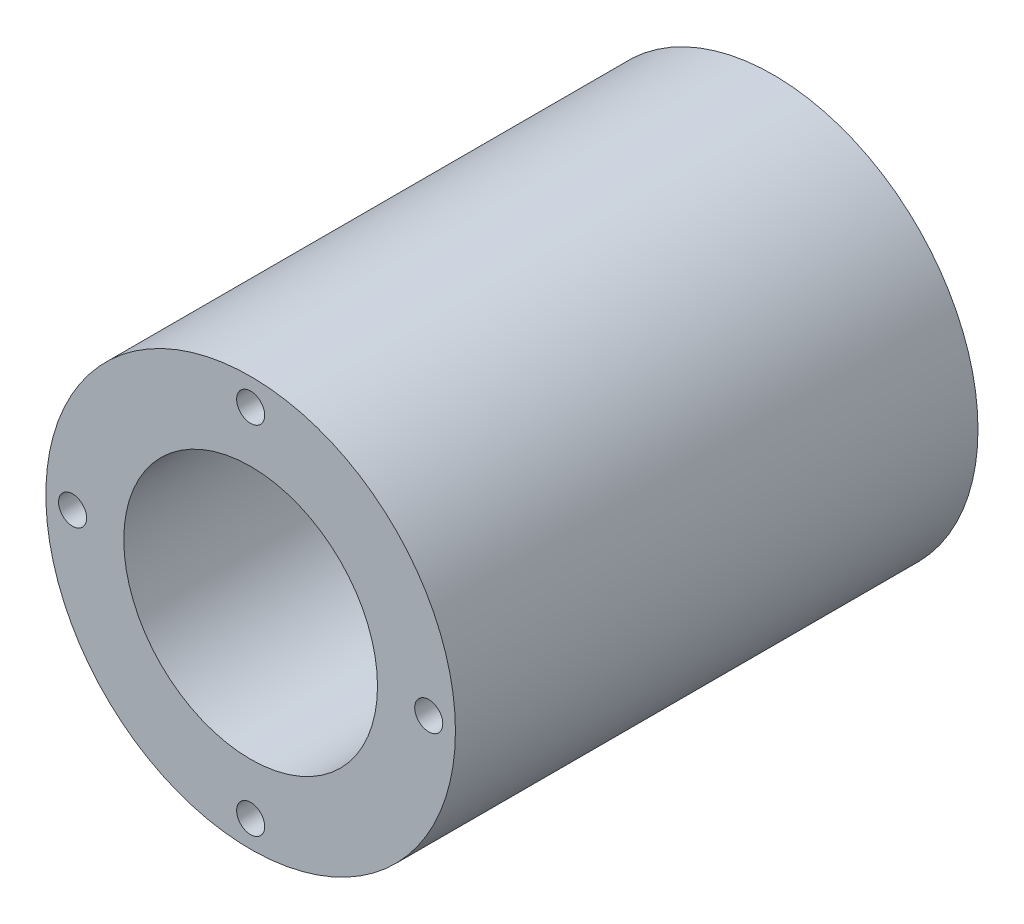
ISO-10303-21;
HEADER;
FILE_DESCRIPTION(('STEP AP214'),'2;1');
FILE_NAME('part.step','',(''),(''),'','','');
FILE_SCHEMA(('AUTOMOTIVE_DESIGN { 1 0 10303 214 1 1 1 1 }'));
ENDSEC;
DATA;
#1=APPLICATION_CONTEXT('core data for automotive mechanical design processes');
#2=APPLICATION_PROTOCOL_DEFINITION('international standard','automotive_design',2000,#1);
#3=PRODUCT_CONTEXT('',#1,'mechanical');
#4=PRODUCT('Part','Part','',(#3));
#5=PRODUCT_RELATED_PRODUCT_CATEGORY('part','',(#4));
#6=PRODUCT_DEFINITION_FORMATION('','',#4);
#7=PRODUCT_DEFINITION_CONTEXT('part definition',#1,'design');
#8=PRODUCT_DEFINITION('design','',#6,#7);
#9=PRODUCT_DEFINITION_SHAPE('','',#8);
#10=(LENGTH_UNIT() NAMED_UNIT(*) SI_UNIT(.MILLI.,.METRE.));
#11=(NAMED_UNIT(*) PLANE_ANGLE_UNIT() SI_UNIT($,.RADIAN.));
#12=(NAMED_UNIT(*) SI_UNIT($,.STERADIAN.) SOLID_ANGLE_UNIT());
#13=UNCERTAINTY_MEASURE_WITH_UNIT(LENGTH_MEASURE(1.E-05),#10,'distance_accuracy_value','');
#14=(GEOMETRIC_REPRESENTATION_CONTEXT(3) GLOBAL_UNCERTAINTY_ASSIGNED_CONTEXT((#13)) GLOBAL_UNIT_ASSIGNED_CONTEXT((#10,
#11,#12)) REPRESENTATION_CONTEXT('',''));
#15=CARTESIAN_POINT('',(0.,0.,0.));
#16=DIRECTION('',(0.,0.,1.));
#17=DIRECTION('',(1.,0.,0.));
#18=AXIS2_PLACEMENT_3D('',#15,#16,#17);
#19=CARTESIAN_POINT('',(0.,0.,119.469000076));
#20=DIRECTION('',(0.,0.,-1.));
#21=DIRECTION('',(-1.,0.,0.));
#22=AXIS2_PLACEMENT_3D('',#19,#20,#21);
#23=PLANE('',#22);
#24=CARTESIAN_POINT('',(-31.75,3.32563597524808E-13,119.469000076));
#25=DIRECTION('',(0.,0.,1.));
#26=DIRECTION('',(1.,0.,0.));
#27=AXIS2_PLACEMENT_3D('',#24,#25,#26);
#28=CIRCLE('',#27,2.5);
#29=CARTESIAN_POINT('',(-29.25,3.32563597524808E-13,119.469000076));
#30=VERTEX_POINT('',#29);
#31=EDGE_CURVE('E88',#30,#30,#28,.T.);
#32=ORIENTED_EDGE('',*,*,#31,.F.);
#33=EDGE_LOOP('',(#32));
#34=FACE_BOUND('',#33,.T.);
#35=CARTESIAN_POINT('',(0.,-31.75,119.469000076));
#36=DIRECTION('',(0.,0.,1.));
#37=DIRECTION('',(1.,0.,0.));
#38=AXIS2_PLACEMENT_3D('',#35,#36,#37);
#39=CIRCLE('',#38,2.5);
#40=CARTESIAN_POINT('',(2.5,-31.75,119.469000076));
#41=VERTEX_POINT('',#40);
#42=EDGE_CURVE('E87',#41,#41,#39,.T.);
#43=ORIENTED_EDGE('',*,*,#42,.F.);
#44=EDGE_LOOP('',(#43));
#45=FACE_BOUND('',#44,.T.);
#46=CARTESIAN_POINT('',(31.75,-1.10854532508269E-13,119.469000076));
#47=DIRECTION('',(0.,0.,1.));
#48=DIRECTION('',(1.,0.,0.));
#49=AXIS2_PLACEMENT_3D('',#46,#47,#48);
#50=CIRCLE('',#49,2.5);
#51=CARTESIAN_POINT('',(34.25,-1.10854532508269E-13,119.469000076));
#52=VERTEX_POINT('',#51);
#53=EDGE_CURVE('E98',#52,#52,#50,.T.);
#54=ORIENTED_EDGE('',*,*,#53,.F.);
#55=EDGE_LOOP('',(#54));
#56=FACE_BOUND('',#55,.T.);
#57=CARTESIAN_POINT('',(0.,31.75,119.469000076));
#58=DIRECTION('',(0.,0.,1.));
#59=DIRECTION('',(1.,0.,0.));
#60=AXIS2_PLACEMENT_3D('',#57,#58,#59);
#61=CIRCLE('',#60,2.5);
#62=CARTESIAN_POINT('',(2.5,31.75,119.469000076));
#63=VERTEX_POINT('',#62);
#64=EDGE_CURVE('E104',#63,#63,#61,.T.);
#65=ORIENTED_EDGE('',*,*,#64,.F.);
#66=EDGE_LOOP('',(#65));
#67=FACE_BOUND('',#66,.T.);
#68=CARTESIAN_POINT('',(0.,0.,119.469000076));
#69=DIRECTION('',(0.,0.,1.));
#70=DIRECTION('',(1.,0.,0.));
#71=AXIS2_PLACEMENT_3D('',#68,#69,#70);
#72=CIRCLE('',#71,22.6187);
#73=CARTESIAN_POINT('',(22.6187,0.,119.469000076));
#74=VERTEX_POINT('',#73);
#75=EDGE_CURVE('E11',#74,#74,#72,.T.);
#76=ORIENTED_EDGE('',*,*,#75,.F.);
#77=EDGE_LOOP('',(#76));
#78=FACE_BOUND('',#77,.T.);
#79=CARTESIAN_POINT('',(0.,0.,119.469000076));
#80=DIRECTION('',(0.,0.,1.));
#81=DIRECTION('',(1.,0.,0.));
#82=AXIS2_PLACEMENT_3D('',#79,#80,#81);
#83=CIRCLE('',#82,36.5125);
#84=CARTESIAN_POINT('',(36.5125,0.,119.469000076));
#85=VERTEX_POINT('',#84);
#86=EDGE_CURVE('E146',#85,#85,#83,.T.);
#87=ORIENTED_EDGE('',*,*,#86,.T.);
#88=EDGE_LOOP('',(#87));
#89=FACE_BOUND('',#88,.T.);
#90=ADVANCED_FACE('F39',(#34,#45,#56,#67,#78,#89),#23,.F.);
#91=CARTESIAN_POINT('',(0.,0.,119.469000076));
#92=DIRECTION('',(0.,0.,1.));
#93=DIRECTION('',(1.,0.,0.));
#94=AXIS2_PLACEMENT_3D('',#91,#92,#93);
#95=CYLINDRICAL_SURFACE('',#94,22.6187);
#96=CARTESIAN_POINT('',(0.,0.,26.3049999359999));
#97=DIRECTION('',(0.,0.,1.));
#98=DIRECTION('',(1.,0.,0.));
#99=AXIS2_PLACEMENT_3D('',#96,#97,#98);
#100=CIRCLE('',#99,22.6187);
#101=CARTESIAN_POINT('',(22.6187,0.,26.3049999359999));
#102=VERTEX_POINT('',#101);
#103=EDGE_CURVE('E46',#102,#102,#100,.T.);
#104=ORIENTED_EDGE('',*,*,#103,.F.);
#105=EDGE_LOOP('',(#104));
#106=FACE_BOUND('',#105,.T.);
#107=ORIENTED_EDGE('',*,*,#75,.T.);
#108=EDGE_LOOP('',(#107));
#109=FACE_BOUND('',#108,.T.);
#110=ADVANCED_FACE('F157',(#106,#109),#95,.F.);
#111=CARTESIAN_POINT('',(0.,0.,26.3049999359999));
#112=DIRECTION('',(0.,0.,-1.));
#113=DIRECTION('',(-1.,0.,0.));
#114=AXIS2_PLACEMENT_3D('',#111,#112,#113);
#115=PLANE('',#114);
#116=CARTESIAN_POINT('',(-26.4705861096263,15.2828000160003,26.3049999359999));
#117=DIRECTION('',(0.,0.,-1.));
#118=DIRECTION('',(-1.,0.,0.));
#119=AXIS2_PLACEMENT_3D('',#116,#117,#118);
#120=CIRCLE('',#119,2.49999999999999);
#121=CARTESIAN_POINT('',(-28.9705861096263,15.2828000160003,26.3049999359999));
#122=VERTEX_POINT('',#121);
#123=EDGE_CURVE('E110',#122,#122,#120,.T.);
#124=ORIENTED_EDGE('',*,*,#123,.F.);
#125=EDGE_LOOP('',(#124));
#126=FACE_BOUND('',#125,.T.);
#127=CARTESIAN_POINT('',(-26.4705861096266,-15.2828000159998,26.3049999359999));
#128=DIRECTION('',(0.,0.,-1.));
#129=DIRECTION('',(-1.,0.,0.));
#130=AXIS2_PLACEMENT_3D('',#127,#128,#129);
#131=CIRCLE('',#130,2.49999999999999);
#132=CARTESIAN_POINT('',(-28.9705861096266,-15.2828000159998,26.3049999359999));
#133=VERTEX_POINT('',#132);
#134=EDGE_CURVE('E116',#133,#133,#131,.T.);
#135=ORIENTED_EDGE('',*,*,#134,.F.);
#136=EDGE_LOOP('',(#135));
#137=FACE_BOUND('',#136,.T.);
#138=CARTESIAN_POINT('',(0.,-30.565600032,26.3049999359999));
#139=DIRECTION('',(0.,0.,-1.));
#140=DIRECTION('',(-1.,0.,0.));
#141=AXIS2_PLACEMENT_3D('',#138,#139,#140);
#142=CIRCLE('',#141,2.49999999999999);
#143=CARTESIAN_POINT('',(-2.49999999999999,-30.565600032,26.3049999359999));
#144=VERTEX_POINT('',#143);
#145=EDGE_CURVE('E122',#144,#144,#142,.T.);
#146=ORIENTED_EDGE('',*,*,#145,.F.);
#147=EDGE_LOOP('',(#146));
#148=FACE_BOUND('',#147,.T.);
#149=CARTESIAN_POINT('',(26.4705861096264,-15.2828000160001,26.3049999359999));
#150=DIRECTION('',(0.,0.,-1.));
#151=DIRECTION('',(-1.,0.,0.));
#152=AXIS2_PLACEMENT_3D('',#149,#150,#151);
#153=CIRCLE('',#152,2.49999999999999);
#154=CARTESIAN_POINT('',(23.9705861096264,-15.2828000160001,26.3049999359999));
#155=VERTEX_POINT('',#154);
#156=EDGE_CURVE('E128',#155,#155,#153,.T.);
#157=ORIENTED_EDGE('',*,*,#156,.F.);
#158=EDGE_LOOP('',(#157));
#159=FACE_BOUND('',#158,.T.);
#160=CARTESIAN_POINT('',(26.4705861096265,15.2828000159999,26.3049999359999));
#161=DIRECTION('',(0.,0.,-1.));
#162=DIRECTION('',(-1.,0.,0.));
#163=AXIS2_PLACEMENT_3D('',#160,#161,#162);
#164=CIRCLE('',#163,2.49999999999999);
#165=CARTESIAN_POINT('',(23.9705861096265,15.2828000159999,26.3049999359999));
#166=VERTEX_POINT('',#165);
#167=EDGE_CURVE('E134',#166,#166,#164,.T.);
#168=ORIENTED_EDGE('',*,*,#167,.F.);
#169=EDGE_LOOP('',(#168));
#170=FACE_BOUND('',#169,.T.);
#171=CARTESIAN_POINT('',(0.,30.565600032,26.3049999359999));
#172=DIRECTION('',(0.,0.,-1.));
#173=DIRECTION('',(-1.,0.,0.));
#174=AXIS2_PLACEMENT_3D('',#171,#172,#173);
#175=CIRCLE('',#174,2.49999999999999);
#176=CARTESIAN_POINT('',(-2.49999999999999,30.565600032,26.3049999359999));
#177=VERTEX_POINT('',#176);
#178=EDGE_CURVE('E140',#177,#177,#175,.T.);
#179=ORIENTED_EDGE('',*,*,#178,.F.);
#180=EDGE_LOOP('',(#179));
#181=FACE_BOUND('',#180,.T.);
#182=ORIENTED_EDGE('',*,*,#103,.T.);
#183=EDGE_LOOP('',(#182));
#184=FACE_BOUND('',#183,.T.);
#185=CARTESIAN_POINT('',(0.,0.,26.3049999359999));
#186=DIRECTION('',(0.,0.,1.));
#187=DIRECTION('',(1.,0.,0.));
#188=AXIS2_PLACEMENT_3D('',#185,#186,#187);
#189=CIRCLE('',#188,36.5125);
#190=CARTESIAN_POINT('',(36.5125,0.,26.3049999359999));
#191=VERTEX_POINT('',#190);
#192=EDGE_CURVE('E149',#191,#191,#189,.T.);
#193=ORIENTED_EDGE('',*,*,#192,.F.);
#194=EDGE_LOOP('',(#193));
#195=FACE_BOUND('',#194,.T.);
#196=ADVANCED_FACE('F154',(#126,#137,#148,#159,#170,#181,#184,#195),#115,.T.);
#197=CARTESIAN_POINT('',(0.,0.,119.469000076));
#198=DIRECTION('',(0.,0.,1.));
#199=DIRECTION('',(1.,0.,0.));
#200=AXIS2_PLACEMENT_3D('',#197,#198,#199);
#201=CYLINDRICAL_SURFACE('',#200,36.5125);
#202=ORIENTED_EDGE('',*,*,#192,.T.);
#203=EDGE_LOOP('',(#202));
#204=FACE_BOUND('',#203,.T.);
#205=ORIENTED_EDGE('',*,*,#86,.F.);
#206=EDGE_LOOP('',(#205));
#207=FACE_BOUND('',#206,.T.);
#208=ADVANCED_FACE('F167',(#204,#207),#201,.T.);
#209=CARTESIAN_POINT('',(0.,30.565600032,41.3049999359999));
#210=DIRECTION('',(0.,0.,-1.));
#211=DIRECTION('',(-1.,0.,0.));
#212=AXIS2_PLACEMENT_3D('',#209,#210,#211);
#213=CONICAL_SURFACE('',#212,2.49999999999999,1.02974425867665);
#214=CARTESIAN_POINT('',(0.,30.565600032,42.8071514835688));
#215=VERTEX_POINT('',#214);
#216=VERTEX_LOOP('',#215);
#217=FACE_BOUND('',#216,.T.);
#218=CARTESIAN_POINT('',(0.,30.565600032,41.3049999359999));
#219=DIRECTION('',(0.,0.,-1.));
#220=DIRECTION('',(-1.,0.,0.));
#221=AXIS2_PLACEMENT_3D('',#218,#219,#220);
#222=CIRCLE('',#221,2.49999999999999);
#223=CARTESIAN_POINT('',(-2.49999999999999,30.565600032,41.3049999359999));
#224=VERTEX_POINT('',#223);
#225=EDGE_CURVE('E143',#224,#224,#222,.T.);
#226=ORIENTED_EDGE('',*,*,#225,.T.);
#227=EDGE_LOOP('',(#226));
#228=FACE_BOUND('',#227,.T.);
#229=ADVANCED_FACE('F169',(#217,#228),#213,.F.);
#230=CARTESIAN_POINT('',(0.,30.565600032,26.3049999359999));
#231=DIRECTION('',(0.,0.,-1.));
#232=DIRECTION('',(-1.,0.,0.));
#233=AXIS2_PLACEMENT_3D('',#230,#231,#232);
#234=CYLINDRICAL_SURFACE('',#233,2.49999999999999);
#235=ORIENTED_EDGE('',*,*,#225,.F.);
#236=EDGE_LOOP('',(#235));
#237=FACE_BOUND('',#236,.T.);
#238=ORIENTED_EDGE('',*,*,#178,.T.);
#239=EDGE_LOOP('',(#238));
#240=FACE_BOUND('',#239,.T.);
#241=ADVANCED_FACE('F176',(#237,#240),#234,.F.);
#242=CARTESIAN_POINT('',(26.4705861096265,15.2828000159999,41.3049999359999));
#243=DIRECTION('',(0.,0.,-1.));
#244=DIRECTION('',(-1.,0.,0.));
#245=AXIS2_PLACEMENT_3D('',#242,#243,#244);
#246=CONICAL_SURFACE('',#245,2.49999999999999,1.02974425867665);
#247=CARTESIAN_POINT('',(26.4705861096265,15.2828000159999,42.8071514835688));
#248=VERTEX_POINT('',#247);
#249=VERTEX_LOOP('',#248);
#250=FACE_BOUND('',#249,.T.);
#251=CARTESIAN_POINT('',(26.4705861096265,15.2828000159999,41.3049999359999));
#252=DIRECTION('',(0.,0.,-1.));
#253=DIRECTION('',(-1.,0.,0.));
#254=AXIS2_PLACEMENT_3D('',#251,#252,#253);
#255=CIRCLE('',#254,2.49999999999999);
#256=CARTESIAN_POINT('',(23.9705861096265,15.2828000159999,41.3049999359999));
#257=VERTEX_POINT('',#256);
#258=EDGE_CURVE('E137',#257,#257,#255,.T.);
#259=ORIENTED_EDGE('',*,*,#258,.T.);
#260=EDGE_LOOP('',(#259));
#261=FACE_BOUND('',#260,.T.);
#262=ADVANCED_FACE('F183',(#250,#261),#246,.F.);
#263=CARTESIAN_POINT('',(26.4705861096265,15.2828000159999,26.3049999359999));
#264=DIRECTION('',(0.,0.,-1.));
#265=DIRECTION('',(-1.,0.,0.));
#266=AXIS2_PLACEMENT_3D('',#263,#264,#265);
#267=CYLINDRICAL_SURFACE('',#266,2.49999999999999);
#268=ORIENTED_EDGE('',*,*,#258,.F.);
#269=EDGE_LOOP('',(#268));
#270=FACE_BOUND('',#269,.T.);
#271=ORIENTED_EDGE('',*,*,#167,.T.);
#272=EDGE_LOOP('',(#271));
#273=FACE_BOUND('',#272,.T.);
#274=ADVANCED_FACE('F187',(#270,#273),#267,.F.);
#275=CARTESIAN_POINT('',(26.4705861096264,-15.2828000160001,41.3049999359999));
#276=DIRECTION('',(0.,0.,-1.));
#277=DIRECTION('',(-1.,0.,0.));
#278=AXIS2_PLACEMENT_3D('',#275,#276,#277);
#279=CONICAL_SURFACE('',#278,2.49999999999999,1.02974425867665);
#280=CARTESIAN_POINT('',(26.4705861096264,-15.2828000160001,42.8071514835688));
#281=VERTEX_POINT('',#280);
#282=VERTEX_LOOP('',#281);
#283=FACE_BOUND('',#282,.T.);
#284=CARTESIAN_POINT('',(26.4705861096264,-15.2828000160001,41.3049999359999));
#285=DIRECTION('',(0.,0.,-1.));
#286=DIRECTION('',(-1.,0.,0.));
#287=AXIS2_PLACEMENT_3D('',#284,#285,#286);
#288=CIRCLE('',#287,2.49999999999999);
#289=CARTESIAN_POINT('',(23.9705861096264,-15.2828000160001,41.3049999359999));
#290=VERTEX_POINT('',#289);
#291=EDGE_CURVE('E131',#290,#290,#288,.T.);
#292=ORIENTED_EDGE('',*,*,#291,.T.);
#293=EDGE_LOOP('',(#292));
#294=FACE_BOUND('',#293,.T.);
#295=ADVANCED_FACE('F190',(#283,#294),#279,.F.);
#296=CARTESIAN_POINT('',(26.4705861096264,-15.2828000160001,26.3049999359999));
#297=DIRECTION('',(0.,0.,-1.));
#298=DIRECTION('',(-1.,0.,0.));
#299=AXIS2_PLACEMENT_3D('',#296,#297,#298);
#300=CYLINDRICAL_SURFACE('',#299,2.49999999999999);
#301=ORIENTED_EDGE('',*,*,#291,.F.);
#302=EDGE_LOOP('',(#301));
#303=FACE_BOUND('',#302,.T.);
#304=ORIENTED_EDGE('',*,*,#156,.T.);
#305=EDGE_LOOP('',(#304));
#306=FACE_BOUND('',#305,.T.);
#307=ADVANCED_FACE('F194',(#303,#306),#300,.F.);
#308=CARTESIAN_POINT('',(0.,-30.565600032,41.3049999359999));
#309=DIRECTION('',(0.,0.,-1.));
#310=DIRECTION('',(-1.,0.,0.));
#311=AXIS2_PLACEMENT_3D('',#308,#309,#310);
#312=CONICAL_SURFACE('',#311,2.49999999999999,1.02974425867665);
#313=CARTESIAN_POINT('',(0.,-30.565600032,42.8071514835688));
#314=VERTEX_POINT('',#313);
#315=VERTEX_LOOP('',#314);
#316=FACE_BOUND('',#315,.T.);
#317=CARTESIAN_POINT('',(0.,-30.565600032,41.3049999359999));
#318=DIRECTION('',(0.,0.,-1.));
#319=DIRECTION('',(-1.,0.,0.));
#320=AXIS2_PLACEMENT_3D('',#317,#318,#319);
#321=CIRCLE('',#320,2.49999999999999);
#322=CARTESIAN_POINT('',(-2.49999999999999,-30.565600032,41.3049999359999));
#323=VERTEX_POINT('',#322);
#324=EDGE_CURVE('E125',#323,#323,#321,.T.);
#325=ORIENTED_EDGE('',*,*,#324,.T.);
#326=EDGE_LOOP('',(#325));
#327=FACE_BOUND('',#326,.T.);
#328=ADVANCED_FACE('F198',(#316,#327),#312,.F.);
#329=CARTESIAN_POINT('',(0.,-30.565600032,26.3049999359999));
#330=DIRECTION('',(0.,0.,-1.));
#331=DIRECTION('',(-1.,0.,0.));
#332=AXIS2_PLACEMENT_3D('',#329,#330,#331);
#333=CYLINDRICAL_SURFACE('',#332,2.49999999999999);
#334=ORIENTED_EDGE('',*,*,#324,.F.);
#335=EDGE_LOOP('',(#334));
#336=FACE_BOUND('',#335,.T.);
#337=ORIENTED_EDGE('',*,*,#145,.T.);
#338=EDGE_LOOP('',(#337));
#339=FACE_BOUND('',#338,.T.);
#340=ADVANCED_FACE('F202',(#336,#339),#333,.F.);
#341=CARTESIAN_POINT('',(-26.4705861096266,-15.2828000159998,41.3049999359999));
#342=DIRECTION('',(0.,0.,-1.));
#343=DIRECTION('',(-1.,0.,0.));
#344=AXIS2_PLACEMENT_3D('',#341,#342,#343);
#345=CONICAL_SURFACE('',#344,2.49999999999999,1.02974425867665);
#346=CARTESIAN_POINT('',(-26.4705861096266,-15.2828000159998,42.8071514835688));
#347=VERTEX_POINT('',#346);
#348=VERTEX_LOOP('',#347);
#349=FACE_BOUND('',#348,.T.);
#350=CARTESIAN_POINT('',(-26.4705861096266,-15.2828000159998,41.3049999359999));
#351=DIRECTION('',(0.,0.,-1.));
#352=DIRECTION('',(-1.,0.,0.));
#353=AXIS2_PLACEMENT_3D('',#350,#351,#352);
#354=CIRCLE('',#353,2.49999999999999);
#355=CARTESIAN_POINT('',(-28.9705861096266,-15.2828000159998,41.3049999359999));
#356=VERTEX_POINT('',#355);
#357=EDGE_CURVE('E119',#356,#356,#354,.T.);
#358=ORIENTED_EDGE('',*,*,#357,.T.);
#359=EDGE_LOOP('',(#358));
#360=FACE_BOUND('',#359,.T.);
#361=ADVANCED_FACE('F206',(#349,#360),#345,.F.);
#362=CARTESIAN_POINT('',(-26.4705861096266,-15.2828000159998,26.3049999359999));
#363=DIRECTION('',(0.,0.,-1.));
#364=DIRECTION('',(-1.,0.,0.));
#365=AXIS2_PLACEMENT_3D('',#362,#363,#364);
#366=CYLINDRICAL_SURFACE('',#365,2.49999999999999);
#367=ORIENTED_EDGE('',*,*,#357,.F.);
#368=EDGE_LOOP('',(#367));
#369=FACE_BOUND('',#368,.T.);
#370=ORIENTED_EDGE('',*,*,#134,.T.);
#371=EDGE_LOOP('',(#370));
#372=FACE_BOUND('',#371,.T.);
#373=ADVANCED_FACE('F210',(#369,#372),#366,.F.);
#374=CARTESIAN_POINT('',(-26.4705861096263,15.2828000160003,41.3049999359999));
#375=DIRECTION('',(0.,0.,-1.));
#376=DIRECTION('',(-1.,0.,0.));
#377=AXIS2_PLACEMENT_3D('',#374,#375,#376);
#378=CONICAL_SURFACE('',#377,2.49999999999999,1.02974425867665);
#379=CARTESIAN_POINT('',(-26.4705861096263,15.2828000160003,42.8071514835688));
#380=VERTEX_POINT('',#379);
#381=VERTEX_LOOP('',#380);
#382=FACE_BOUND('',#381,.T.);
#383=CARTESIAN_POINT('',(-26.4705861096263,15.2828000160003,41.3049999359999));
#384=DIRECTION('',(0.,0.,-1.));
#385=DIRECTION('',(-1.,0.,0.));
#386=AXIS2_PLACEMENT_3D('',#383,#384,#385);
#387=CIRCLE('',#386,2.49999999999999);
#388=CARTESIAN_POINT('',(-28.9705861096263,15.2828000160003,41.3049999359999));
#389=VERTEX_POINT('',#388);
#390=EDGE_CURVE('E113',#389,#389,#387,.T.);
#391=ORIENTED_EDGE('',*,*,#390,.T.);
#392=EDGE_LOOP('',(#391));
#393=FACE_BOUND('',#392,.T.);
#394=ADVANCED_FACE('F214',(#382,#393),#378,.F.);
#395=CARTESIAN_POINT('',(-26.4705861096263,15.2828000160003,26.3049999359999));
#396=DIRECTION('',(0.,0.,-1.));
#397=DIRECTION('',(-1.,0.,0.));
#398=AXIS2_PLACEMENT_3D('',#395,#396,#397);
#399=CYLINDRICAL_SURFACE('',#398,2.49999999999999);
#400=ORIENTED_EDGE('',*,*,#390,.F.);
#401=EDGE_LOOP('',(#400));
#402=FACE_BOUND('',#401,.T.);
#403=ORIENTED_EDGE('',*,*,#123,.T.);
#404=EDGE_LOOP('',(#403));
#405=FACE_BOUND('',#404,.T.);
#406=ADVANCED_FACE('F218',(#402,#405),#399,.F.);
#407=CARTESIAN_POINT('',(0.,31.75,104.469000076));
#408=DIRECTION('',(0.,0.,1.));
#409=DIRECTION('',(1.,0.,0.));
#410=AXIS2_PLACEMENT_3D('',#407,#408,#409);
#411=CONICAL_SURFACE('',#410,2.5,1.02974425867665);
#412=CARTESIAN_POINT('',(0.,31.75,102.966848528431));
#413=VERTEX_POINT('',#412);
#414=VERTEX_LOOP('',#413);
#415=FACE_BOUND('',#414,.T.);
#416=CARTESIAN_POINT('',(0.,31.75,104.469000076));
#417=DIRECTION('',(0.,0.,1.));
#418=DIRECTION('',(1.,0.,0.));
#419=AXIS2_PLACEMENT_3D('',#416,#417,#418);
#420=CIRCLE('',#419,2.5);
#421=CARTESIAN_POINT('',(2.5,31.75,104.469000076));
#422=VERTEX_POINT('',#421);
#423=EDGE_CURVE('E107',#422,#422,#420,.T.);
#424=ORIENTED_EDGE('',*,*,#423,.T.);
#425=EDGE_LOOP('',(#424));
#426=FACE_BOUND('',#425,.T.);
#427=ADVANCED_FACE('F222',(#415,#426),#411,.F.);
#428=CARTESIAN_POINT('',(0.,31.75,119.469000076));
#429=DIRECTION('',(0.,0.,1.));
#430=DIRECTION('',(1.,0.,0.));
#431=AXIS2_PLACEMENT_3D('',#428,#429,#430);
#432=CYLINDRICAL_SURFACE('',#431,2.5);
#433=ORIENTED_EDGE('',*,*,#423,.F.);
#434=EDGE_LOOP('',(#433));
#435=FACE_BOUND('',#434,.T.);
#436=ORIENTED_EDGE('',*,*,#64,.T.);
#437=EDGE_LOOP('',(#436));
#438=FACE_BOUND('',#437,.T.);
#439=ADVANCED_FACE('F226',(#435,#438),#432,.F.);
#440=CARTESIAN_POINT('',(31.75,-1.10854532508269E-13,104.469000076));
#441=DIRECTION('',(0.,0.,1.));
#442=DIRECTION('',(1.,0.,0.));
#443=AXIS2_PLACEMENT_3D('',#440,#441,#442);
#444=CONICAL_SURFACE('',#443,2.5,1.02974425867665);
#445=CARTESIAN_POINT('',(31.75,-1.10854532508269E-13,102.966848528431));
#446=VERTEX_POINT('',#445);
#447=VERTEX_LOOP('',#446);
#448=FACE_BOUND('',#447,.T.);
#449=CARTESIAN_POINT('',(31.75,-1.10854532508269E-13,104.469000076));
#450=DIRECTION('',(0.,0.,1.));
#451=DIRECTION('',(1.,0.,0.));
#452=AXIS2_PLACEMENT_3D('',#449,#450,#451);
#453=CIRCLE('',#452,2.5);
#454=CARTESIAN_POINT('',(34.25,-1.10854532508269E-13,104.469000076));
#455=VERTEX_POINT('',#454);
#456=EDGE_CURVE('E101',#455,#455,#453,.T.);
#457=ORIENTED_EDGE('',*,*,#456,.T.);
#458=EDGE_LOOP('',(#457));
#459=FACE_BOUND('',#458,.T.);
#460=ADVANCED_FACE('F230',(#448,#459),#444,.F.);
#461=CARTESIAN_POINT('',(31.75,-1.10854532508269E-13,119.469000076));
#462=DIRECTION('',(0.,0.,1.));
#463=DIRECTION('',(1.,0.,0.));
#464=AXIS2_PLACEMENT_3D('',#461,#462,#463);
#465=CYLINDRICAL_SURFACE('',#464,2.5);
#466=ORIENTED_EDGE('',*,*,#456,.F.);
#467=EDGE_LOOP('',(#466));
#468=FACE_BOUND('',#467,.T.);
#469=ORIENTED_EDGE('',*,*,#53,.T.);
#470=EDGE_LOOP('',(#469));
#471=FACE_BOUND('',#470,.T.);
#472=ADVANCED_FACE('F234',(#468,#471),#465,.F.);
#473=CARTESIAN_POINT('',(0.,-31.75,104.469000076));
#474=DIRECTION('',(0.,0.,1.));
#475=DIRECTION('',(1.,0.,0.));
#476=AXIS2_PLACEMENT_3D('',#473,#474,#475);
#477=CONICAL_SURFACE('',#476,2.5,1.02974425867665);
#478=CARTESIAN_POINT('',(0.,-31.75,102.966848528431));
#479=VERTEX_POINT('',#478);
#480=VERTEX_LOOP('',#479);
#481=FACE_BOUND('',#480,.T.);
#482=CARTESIAN_POINT('',(0.,-31.75,104.469000076));
#483=DIRECTION('',(0.,0.,1.));
#484=DIRECTION('',(1.,0.,0.));
#485=AXIS2_PLACEMENT_3D('',#482,#483,#484);
#486=CIRCLE('',#485,2.5);
#487=CARTESIAN_POINT('',(2.5,-31.75,104.469000076));
#488=VERTEX_POINT('',#487);
#489=EDGE_CURVE('E91',#488,#488,#486,.T.);
#490=ORIENTED_EDGE('',*,*,#489,.T.);
#491=EDGE_LOOP('',(#490));
#492=FACE_BOUND('',#491,.T.);
#493=ADVANCED_FACE('F238',(#481,#492),#477,.F.);
#494=CARTESIAN_POINT('',(0.,-31.75,119.469000076));
#495=DIRECTION('',(0.,0.,1.));
#496=DIRECTION('',(1.,0.,0.));
#497=AXIS2_PLACEMENT_3D('',#494,#495,#496);
#498=CYLINDRICAL_SURFACE('',#497,2.5);
#499=ORIENTED_EDGE('',*,*,#489,.F.);
#500=EDGE_LOOP('',(#499));
#501=FACE_BOUND('',#500,.T.);
#502=ORIENTED_EDGE('',*,*,#42,.T.);
#503=EDGE_LOOP('',(#502));
#504=FACE_BOUND('',#503,.T.);
#505=ADVANCED_FACE('F81',(#501,#504),#498,.F.);
#506=CARTESIAN_POINT('',(-31.75,3.32563597524808E-13,104.469000076));
#507=DIRECTION('',(0.,0.,1.));
#508=DIRECTION('',(1.,0.,0.));
#509=AXIS2_PLACEMENT_3D('',#506,#507,#508);
#510=CONICAL_SURFACE('',#509,2.5,1.02974425867665);
#511=CARTESIAN_POINT('',(-31.75,3.32563597524808E-13,102.966848528431));
#512=VERTEX_POINT('',#511);
#513=VERTEX_LOOP('',#512);
#514=FACE_BOUND('',#513,.T.);
#515=CARTESIAN_POINT('',(-31.75,3.32563597524808E-13,104.469000076));
#516=DIRECTION('',(0.,0.,1.));
#517=DIRECTION('',(1.,0.,0.));
#518=AXIS2_PLACEMENT_3D('',#515,#516,#517);
#519=CIRCLE('',#518,2.5);
#520=CARTESIAN_POINT('',(-29.25,3.32563597524808E-13,104.469000076));
#521=VERTEX_POINT('',#520);
#522=EDGE_CURVE('E85',#521,#521,#519,.T.);
#523=ORIENTED_EDGE('',*,*,#522,.T.);
#524=EDGE_LOOP('',(#523));
#525=FACE_BOUND('',#524,.T.);
#526=ADVANCED_FACE('F77',(#514,#525),#510,.F.);
#527=CARTESIAN_POINT('',(-31.75,3.32563597524808E-13,119.469000076));
#528=DIRECTION('',(0.,0.,1.));
#529=DIRECTION('',(1.,0.,0.));
#530=AXIS2_PLACEMENT_3D('',#527,#528,#529);
#531=CYLINDRICAL_SURFACE('',#530,2.5);
#532=ORIENTED_EDGE('',*,*,#522,.F.);
#533=EDGE_LOOP('',(#532));
#534=FACE_BOUND('',#533,.T.);
#535=ORIENTED_EDGE('',*,*,#31,.T.);
#536=EDGE_LOOP('',(#535));
#537=FACE_BOUND('',#536,.T.);
#538=ADVANCED_FACE('F80',(#534,#537),#531,.F.);
#539=CLOSED_SHELL('',(#90,#110,#196,#208,#229,#241,#262,#274,#295,#307,#328,#340,#361,#373,#394,
#406,#427,#439,#460,#472,#493,#505,#526,#538));
#540=MANIFOLD_SOLID_BREP('B2',#539);
#541=ADVANCED_BREP_SHAPE_REPRESENTATION('',(#18,#540),#14);
#542=SHAPE_DEFINITION_REPRESENTATION(#9,#541);
ENDSEC;
END-ISO-10303-21;
